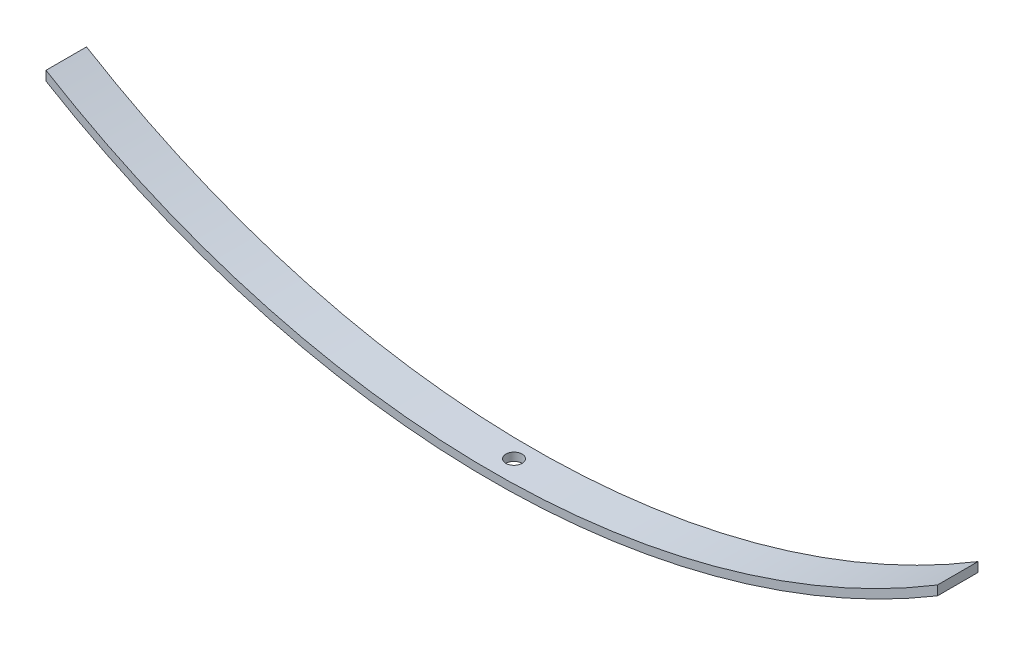
ISO-10303-21;
HEADER;
FILE_DESCRIPTION(('STEP AP214'),'2;1');
FILE_NAME('part.step','',(''),(''),'','','');
FILE_SCHEMA(('AUTOMOTIVE_DESIGN { 1 0 10303 214 1 1 1 1 }'));
ENDSEC;
DATA;
#1=APPLICATION_CONTEXT('core data for automotive mechanical design processes');
#2=APPLICATION_PROTOCOL_DEFINITION('international standard','automotive_design',2000,#1);
#3=PRODUCT_CONTEXT('',#1,'mechanical');
#4=PRODUCT('Part','Part','',(#3));
#5=PRODUCT_RELATED_PRODUCT_CATEGORY('part','',(#4));
#6=PRODUCT_DEFINITION_FORMATION('','',#4);
#7=PRODUCT_DEFINITION_CONTEXT('part definition',#1,'design');
#8=PRODUCT_DEFINITION('design','',#6,#7);
#9=PRODUCT_DEFINITION_SHAPE('','',#8);
#10=(LENGTH_UNIT() NAMED_UNIT(*) SI_UNIT(.MILLI.,.METRE.));
#11=(NAMED_UNIT(*) PLANE_ANGLE_UNIT() SI_UNIT($,.RADIAN.));
#12=(NAMED_UNIT(*) SI_UNIT($,.STERADIAN.) SOLID_ANGLE_UNIT());
#13=UNCERTAINTY_MEASURE_WITH_UNIT(LENGTH_MEASURE(1.E-05),#10,'distance_accuracy_value','');
#14=(GEOMETRIC_REPRESENTATION_CONTEXT(3) GLOBAL_UNCERTAINTY_ASSIGNED_CONTEXT((#13)) GLOBAL_UNIT_ASSIGNED_CONTEXT((#10,
#11,#12)) REPRESENTATION_CONTEXT('',''));
#15=CARTESIAN_POINT('',(0.,0.,0.));
#16=DIRECTION('',(0.,0.,1.));
#17=DIRECTION('',(1.,0.,0.));
#18=AXIS2_PLACEMENT_3D('',#15,#16,#17);
#19=CARTESIAN_POINT('',(-550.,-906.145683651365,50.));
#20=DIRECTION('',(1.,0.,0.));
#21=DIRECTION('',(0.,1.,0.));
#22=AXIS2_PLACEMENT_3D('',#19,#20,#21);
#23=PLANE('',#22);
#24=DIRECTION('',(0.,-1.,0.));
#25=VECTOR('',#24,1.);
#26=CARTESIAN_POINT('',(-550.,-906.145683651365,0.));
#27=LINE('',#26,#25);
#28=CARTESIAN_POINT('',(-550.,-906.145683651365,0.));
#29=VERTEX_POINT('',#28);
#30=CARTESIAN_POINT('',(-550.,-917.823512446701,0.));
#31=VERTEX_POINT('',#30);
#32=EDGE_CURVE('E114',#29,#31,#27,.T.);
#33=ORIENTED_EDGE('',*,*,#32,.T.);
#34=DIRECTION('',(0.,0.,-1.));
#35=VECTOR('',#34,1.);
#36=CARTESIAN_POINT('',(-550.,-917.823512446701,50.));
#37=LINE('',#36,#35);
#38=CARTESIAN_POINT('',(-550.,-917.823512446701,50.));
#39=VERTEX_POINT('',#38);
#40=EDGE_CURVE('E11',#39,#31,#37,.T.);
#41=ORIENTED_EDGE('',*,*,#40,.F.);
#42=DIRECTION('',(0.,-1.,0.));
#43=VECTOR('',#42,1.);
#44=CARTESIAN_POINT('',(-550.,-906.145683651365,50.));
#45=LINE('',#44,#43);
#46=CARTESIAN_POINT('',(-550.,-906.145683651365,50.));
#47=VERTEX_POINT('',#46);
#48=EDGE_CURVE('E95',#47,#39,#45,.T.);
#49=ORIENTED_EDGE('',*,*,#48,.F.);
#50=DIRECTION('',(0.,0.,-1.));
#51=VECTOR('',#50,1.);
#52=CARTESIAN_POINT('',(-550.,-906.145683651365,50.));
#53=LINE('',#52,#51);
#54=EDGE_CURVE('E62',#47,#29,#53,.T.);
#55=ORIENTED_EDGE('',*,*,#54,.T.);
#56=EDGE_LOOP('',(#33,#41,#49,#55));
#57=FACE_BOUND('',#56,.T.);
#58=ADVANCED_FACE('F39',(#57),#23,.F.);
#59=CARTESIAN_POINT('',(0.,0.,50.));
#60=DIRECTION('',(0.,0.,-1.));
#61=DIRECTION('',(-1.,0.,0.));
#62=AXIS2_PLACEMENT_3D('',#59,#60,#61);
#63=CYLINDRICAL_SURFACE('',#62,1070.);
#64=CARTESIAN_POINT('',(0.,-1070.,32.5));
#65=CARTESIAN_POINT('',(0.280946709399363,-1070.00000005261,32.5000020219782));
#66=CARTESIAN_POINT('',(0.561860258569174,-1069.99988911589,32.4881554779434));
#67=CARTESIAN_POINT('',(1.12178434572434,-1069.99944858046,32.4408520448031));
#68=CARTESIAN_POINT('',(1.40079436397135,-1069.99911892426,32.4053889491154));
#69=CARTESIAN_POINT('',(1.9551278123037,-1069.99824971584,32.3110454763084));
#70=CARTESIAN_POINT('',(2.23044699894896,-1069.99770994041,32.2521401958444));
#71=CARTESIAN_POINT('',(2.77514610562203,-1069.99643585478,32.1113315401694));
#72=CARTESIAN_POINT('',(3.04452592036136,-1069.99570154112,32.0294277576122));
#73=CARTESIAN_POINT('',(3.57529048389846,-1069.99405965653,31.843251723385));
#74=CARTESIAN_POINT('',(3.83667913222468,-1069.99315217171,31.7389905873443));
#75=CARTESIAN_POINT('',(4.34974689538885,-1069.99118946,31.5088155518721));
#76=CARTESIAN_POINT('',(4.60142585697582,-1069.99013423078,31.382901310854));
#77=CARTESIAN_POINT('',(5.09321968019006,-1069.98790627522,31.1103501854637));
#78=CARTESIAN_POINT('',(5.3333373685907,-1069.98673357782,30.9637184014588));
#79=CARTESIAN_POINT('',(5.80036342768898,-1069.98430377445,30.6507544032666));
#80=CARTESIAN_POINT('',(6.02727207974481,-1069.98304667028,30.4844226089271));
#81=CARTESIAN_POINT('',(6.46630437336098,-1069.98048352069,30.1332131728421));
#82=CARTESIAN_POINT('',(6.67842590669653,-1069.97917746834,29.9483328957356));
#83=CARTESIAN_POINT('',(7.08634086928212,-1069.97655366153,29.5613602644561));
#84=CARTESIAN_POINT('',(7.28213428171446,-1069.97523590706,29.3592678925554));
#85=CARTESIAN_POINT('',(7.65600828359203,-1069.97262605058,28.93929957536));
#86=CARTESIAN_POINT('',(7.83408818237894,-1069.97133394957,28.7214230152045));
#87=CARTESIAN_POINT('',(8.17126043767984,-1069.96881213292,28.2714421783338));
#88=CARTESIAN_POINT('',(8.33035279781838,-1069.96758241725,28.0393379043347));
#89=CARTESIAN_POINT('',(8.62841890604349,-1069.9652202806,27.5625516582053));
#90=CARTESIAN_POINT('',(8.76739265877536,-1069.9640878596,27.3178696889792));
#91=CARTESIAN_POINT('',(9.02423349328664,-1069.96195246023,26.817667452605));
#92=CARTESIAN_POINT('',(9.14210057433841,-1069.96094948187,26.5621471850833));
#93=CARTESIAN_POINT('',(9.35588973070462,-1069.95910144411,26.042085496426));
#94=CARTESIAN_POINT('',(9.45181185367025,-1069.95825638437,25.7775440948803));
#95=CARTESIAN_POINT('',(9.62102931702547,-1069.95674817298,25.2413203891744));
#96=CARTESIAN_POINT('',(9.6943246581406,-1069.95608502133,24.9696380852433));
#97=CARTESIAN_POINT('',(9.8177656134568,-1069.95495946936,24.4210717927941));
#98=CARTESIAN_POINT('',(9.86791186903572,-1069.95449706348,24.1441879486132));
#99=CARTESIAN_POINT('',(9.94470103652754,-1069.95378610425,23.5871798139389));
#100=CARTESIAN_POINT('',(9.97134394886183,-1069.9535375509,23.3070555235036));
#101=CARTESIAN_POINT('',(10.0009369251396,-1069.95326135348,22.745558693575));
#102=CARTESIAN_POINT('',(10.0038870362827,-1069.95323370897,22.4641861565695));
#103=CARTESIAN_POINT('',(9.98607355343044,-1069.95340011308,21.9021928039145));
#104=CARTESIAN_POINT('',(9.96530995985493,-1069.95359416169,21.6215719882517));
#105=CARTESIAN_POINT('',(9.90021774194708,-1069.95419843338,21.063085892533));
#106=CARTESIAN_POINT('',(9.85588984671182,-1069.95460864978,20.7852205274923));
#107=CARTESIAN_POINT('',(9.74398469566442,-1069.95563360758,20.2342119346919));
#108=CARTESIAN_POINT('',(9.67640744038471,-1069.95624834898,19.9610687068241));
#109=CARTESIAN_POINT('',(9.51848400086335,-1069.95766490618,19.4214458629587));
#110=CARTESIAN_POINT('',(9.42813779081109,-1069.95846672219,19.1549662545155));
#111=CARTESIAN_POINT('',(9.22531886426693,-1069.96023466691,18.6305653092706));
#112=CARTESIAN_POINT('',(9.11284614723762,-1069.96120079564,18.3726439726769));
#113=CARTESIAN_POINT('',(8.86657194696063,-1069.96326995677,17.8671890771995));
#114=CARTESIAN_POINT('',(8.73277013226972,-1069.96437299132,17.6196556798146));
#115=CARTESIAN_POINT('',(8.44479025088656,-1069.96668464098,17.1367404971639));
#116=CARTESIAN_POINT('',(8.29061218406701,-1069.9678932561,16.901358711974));
#117=CARTESIAN_POINT('',(7.96297588230343,-1069.97038175916,16.4444199511567));
#118=CARTESIAN_POINT('',(7.78951765090164,-1069.97166164708,16.2228629729893));
#119=CARTESIAN_POINT('',(7.42455404435858,-1069.97425636637,15.7951486411169));
#120=CARTESIAN_POINT('',(7.2330486687334,-1069.97557119774,15.5889912878247));
#121=CARTESIAN_POINT('',(6.83334437545968,-1069.97819853345,15.1935340163514));
#122=CARTESIAN_POINT('',(6.62514481679003,-1069.97951103771,15.0042347460743));
#123=CARTESIAN_POINT('',(6.19353859250772,-1069.98209641127,14.6438482514079));
#124=CARTESIAN_POINT('',(5.97013192647632,-1069.98336928057,14.4727610275199));
#125=CARTESIAN_POINT('',(5.50969959167318,-1069.98583925222,14.1500149001624));
#126=CARTESIAN_POINT('',(5.27267392085479,-1069.98703635456,13.9983559996124));
#127=CARTESIAN_POINT('',(4.78668858570178,-1069.98932081062,13.7155447885444));
#128=CARTESIAN_POINT('',(4.53772892150938,-1069.99040816433,13.584392477782));
#129=CARTESIAN_POINT('',(4.02964523023157,-1069.99244225764,13.343526841121));
#130=CARTESIAN_POINT('',(3.7705211940157,-1069.99338899709,13.2338135344812));
#131=CARTESIAN_POINT('',(3.24395115983016,-1069.99511498548,13.0366061819905));
#132=CARTESIAN_POINT('',(2.97650516181951,-1069.99589423442,12.949112136249));
#133=CARTESIAN_POINT('',(2.4351927085557,-1069.99726312058,12.7969655059618));
#134=CARTESIAN_POINT('',(2.16132625495607,-1069.99785275785,12.7323129155336));
#135=CARTESIAN_POINT('',(1.60911998119206,-1069.99882568237,12.6263089459468));
#136=CARTESIAN_POINT('',(1.33078016117178,-1069.99920896961,12.5849575660377));
#137=CARTESIAN_POINT('',(0.771616762050556,-1069.99975830284,12.5258512192009));
#138=CARTESIAN_POINT('',(0.490793277391732,-1069.99992435705,12.5080953588967));
#139=CARTESIAN_POINT('',(-0.0713512948975476,-1070.00003453744,12.4963034142504));
#140=CARTESIAN_POINT('',(-0.352672382515532,-1069.99997866362,12.5022673293137));
#141=CARTESIAN_POINT('',(-0.913812039534928,-1069.99964657401,12.5378725206576));
#142=CARTESIAN_POINT('',(-1.19363060903823,-1069.99937035824,12.5675137953324));
#143=CARTESIAN_POINT('',(-1.7497758508029,-1069.99860542548,12.6502629117168));
#144=CARTESIAN_POINT('',(-2.0261025230716,-1069.99811670848,12.7033707533772));
#145=CARTESIAN_POINT('',(-2.57329464434593,-1069.9969406563,12.8326742092626));
#146=CARTESIAN_POINT('',(-2.84416018895979,-1069.9962533246,12.9088694189209));
#147=CARTESIAN_POINT('',(-3.37850947532746,-1069.99469954933,13.0838061441901));
#148=CARTESIAN_POINT('',(-3.64199321719978,-1069.99383310577,13.182547659439));
#149=CARTESIAN_POINT('',(-4.15970589433161,-1069.99194570003,13.4018749406224));
#150=CARTESIAN_POINT('',(-4.4139348292936,-1069.99092473785,13.522460707259));
#151=CARTESIAN_POINT('',(-4.91133073448293,-1069.98875727368,13.7846191786094));
#152=CARTESIAN_POINT('',(-5.15449770436772,-1069.98761077169,13.926191883973));
#153=CARTESIAN_POINT('',(-5.62804832072535,-1069.98522473376,14.2293223353087));
#154=CARTESIAN_POINT('',(-5.85843158332697,-1069.98398519502,14.390880680943));
#155=CARTESIAN_POINT('',(-6.30476924676205,-1069.98144829814,14.7328305346174));
#156=CARTESIAN_POINT('',(-6.52072364733334,-1069.98015093999,14.9132220429996));
#157=CARTESIAN_POINT('',(-6.93666862510528,-1069.97753522893,15.291555984157));
#158=CARTESIAN_POINT('',(-7.13665919289806,-1069.976216876,15.4894984272751));
#159=CARTESIAN_POINT('',(-7.51925473997275,-1069.97359659786,15.9015270782127));
#160=CARTESIAN_POINT('',(-7.70185971896571,-1069.97229467266,16.1156132863003));
#161=CARTESIAN_POINT('',(-8.04839140577304,-1069.96974416613,16.5584145610562));
#162=CARTESIAN_POINT('',(-8.21231753191685,-1069.96849558647,16.7871300829439));
#163=CARTESIAN_POINT('',(-8.52031952595199,-1069.96608725878,17.2575580963166));
#164=CARTESIAN_POINT('',(-8.66439539337814,-1069.96492751075,17.4992705881062));
#165=CARTESIAN_POINT('',(-8.93167235157635,-1069.96272977122,17.9939739235596));
#166=CARTESIAN_POINT('',(-9.05487346610634,-1069.96169177959,18.2469647543868));
#167=CARTESIAN_POINT('',(-9.27952510989939,-1069.95976701951,18.7624264542783));
#168=CARTESIAN_POINT('',(-9.38097563971865,-1069.95888025107,19.0248973231001));
#169=CARTESIAN_POINT('',(-9.56140318093276,-1069.95728312651,19.5574485404603));
#170=CARTESIAN_POINT('',(-9.64038057428726,-1069.9565727674,19.8275287595821));
#171=CARTESIAN_POINT('',(-9.77530252465397,-1069.95534860922,20.3733828059871));
#172=CARTESIAN_POINT('',(-9.83124708181193,-1069.95483481016,20.6491566332341));
#173=CARTESIAN_POINT('',(-9.91970557950575,-1069.95401835847,21.2044376442965));
#174=CARTESIAN_POINT('',(-9.95221948292979,-1069.95371570618,21.4839448340243));
#175=CARTESIAN_POINT('',(-9.99358529494173,-1069.95333014225,22.0447048463585));
#176=CARTESIAN_POINT('',(-10.0024372041507,-1069.9532472306,22.325957668919));
#177=CARTESIAN_POINT('',(-9.9964161971355,-1069.95330350068,22.8881979613776));
#178=CARTESIAN_POINT('',(-9.98154423024218,-1069.95344267352,23.1691854414434));
#179=CARTESIAN_POINT('',(-9.92818301130804,-1069.95393914495,23.728908646602));
#180=CARTESIAN_POINT('',(-9.88969375988386,-1069.95429644353,24.0076443717537));
#181=CARTESIAN_POINT('',(-9.78937157565989,-1069.95521902388,24.5608829882929));
#182=CARTESIAN_POINT('',(-9.72753859610564,-1069.95578430606,24.8353858712016));
#183=CARTESIAN_POINT('',(-9.58096865212942,-1069.95710680606,25.3782067332176));
#184=CARTESIAN_POINT('',(-9.4962316878409,-1069.95786402387,25.6465247123611));
#185=CARTESIAN_POINT('',(-9.30445452363841,-1069.95954891476,26.1750731926403));
#186=CARTESIAN_POINT('',(-9.19741391233159,-1069.96047659099,26.4353035444972));
#187=CARTESIAN_POINT('',(-8.96179146256603,-1069.96247605477,26.9458216873728));
#188=CARTESIAN_POINT('',(-8.83320961998844,-1069.96354784234,27.1961094764904));
#189=CARTESIAN_POINT('',(-8.55542428540885,-1069.96580505963,27.684953771166));
#190=CARTESIAN_POINT('',(-8.4062215909967,-1069.96699048496,27.9235107299749));
#191=CARTESIAN_POINT('',(-8.0882515628819,-1069.96944136421,28.3872078756654));
#192=CARTESIAN_POINT('',(-7.91948424836325,-1069.97070681805,28.6123480757024));
#193=CARTESIAN_POINT('',(-7.56359819644914,-1069.9732817382,29.0475949734432));
#194=CARTESIAN_POINT('',(-7.37648087016256,-1069.97459120113,29.2577028249831));
#195=CARTESIAN_POINT('',(-6.9852095945659,-1069.977217099,29.661415214439));
#196=CARTESIAN_POINT('',(-6.78105528143564,-1069.9785335341,29.855019399745));
#197=CARTESIAN_POINT('',(-6.35711213727609,-1069.98113630944,30.2243889733519));
#198=CARTESIAN_POINT('',(-6.13731947065003,-1069.9824226422,30.4001499594451));
#199=CARTESIAN_POINT('',(-5.68371073552113,-1069.98492833418,30.7325263487437));
#200=CARTESIAN_POINT('',(-5.44989488833631,-1069.98614769447,30.8891420539872));
#201=CARTESIAN_POINT('',(-4.96977576625828,-1069.98848544104,31.1821925004505));
#202=CARTESIAN_POINT('',(-4.7234661635387,-1069.98960377535,31.3186168753402));
#203=CARTESIAN_POINT('',(-4.22022898317542,-1069.99170696479,31.5702153146765));
#204=CARTESIAN_POINT('',(-3.96330159368535,-1069.99269182229,31.6853897554874));
#205=CARTESIAN_POINT('',(-3.4409258912913,-1069.9944991244,31.8935611152162));
#206=CARTESIAN_POINT('',(-3.17548693798505,-1069.99532174075,31.9865815066002));
#207=CARTESIAN_POINT('',(-2.63780704593059,-1069.99678235988,32.1499179917883));
#208=CARTESIAN_POINT('',(-2.36556791372969,-1069.99742041113,32.2202400479897));
#209=CARTESIAN_POINT('',(-1.74755139998692,-1069.99862792379,32.3523719047565));
#210=CARTESIAN_POINT('',(-1.40036592937559,-1069.99914059822,32.4076854069609));
#211=CARTESIAN_POINT('',(-0.702103050329412,-1069.99982660345,32.4814981908989));
#212=CARTESIAN_POINT('',(-0.351025642003471,-1069.99999993426,32.4999974736626));
#213=CARTESIAN_POINT('',(0.,-1070.,32.5));
#214=B_SPLINE_CURVE_WITH_KNOTS('',3,(#64,#65,#66,#67,#68,#69,#70,#71,#72,#73,#74,#75,#76,#77,
#78,#79,#80,#81,#82,#83,#84,#85,#86,#87,#88,#89,#90,#91,#92,#93,#94,#95,#96,#97,#98,#99,#100,
#101,#102,#103,#104,#105,#106,#107,#108,#109,#110,#111,#112,#113,#114,#115,#116,#117,#118,#119,
#120,#121,#122,#123,#124,#125,#126,#127,#128,#129,#130,#131,#132,#133,#134,#135,#136,#137,#138,
#139,#140,#141,#142,#143,#144,#145,#146,#147,#148,#149,#150,#151,#152,#153,#154,#155,#156,#157,
#158,#159,#160,#161,#162,#163,#164,#165,#166,#167,#168,#169,#170,#171,#172,#173,#174,#175,#176,
#177,#178,#179,#180,#181,#182,#183,#184,#185,#186,#187,#188,#189,#190,#191,#192,#193,#194,#195,
#196,#197,#198,#199,#200,#201,#202,#203,#204,#205,#206,#207,#208,#209,#210,#211,#212,#213),
.UNSPECIFIED.,.T.,.F.,(4,2,2,2,2,2,2,2,2,2,2,2,2,2,2,2,2,2,2,2,2,2,2,2,2,2,2,2,2,2,2,2,2,2,2,2,
2,2,2,2,2,2,2,2,2,2,2,2,2,2,2,2,2,2,2,2,2,2,2,2,2,2,2,2,2,2,2,2,2,2,2,2,2,2,4),(0.,
0.842533505309557,1.68528852129294,2.52894122168211,3.37260886567131,4.21585802348987,
5.05912048512914,5.90217570798131,6.74521296681656,7.58837017413102,8.43152824987265,
9.27471918787258,10.1179099649152,10.9611005472681,11.8042911586896,12.6474799391928,
13.4906686926579,14.3338340829951,15.1769994582153,16.0201631537264,16.8633268343126,
17.7064644283038,18.5496020029863,19.3927405334434,20.2358790843792,21.079030738533,
21.9221823979543,22.7653339024686,23.6084854295907,24.4516693474551,25.2948532885383,
26.138037356336,26.9812214140859,27.824406229269,28.6675910486046,29.5107756507889,
30.3539602258154,31.1971128751735,32.0402655033996,32.8834180744486,33.7265706437284,
34.5697084390529,35.4128462208424,36.2559840297381,37.0991218647428,37.9422850039405,
38.7854481584587,39.6286118098692,40.4717754752928,41.3149653901617,42.1581553247906,
43.0013442997636,43.8445332531746,44.6877078746562,45.5308824908024,46.3740584424505,
47.2172343719656,48.0603765619304,48.9035187298813,49.7466625865453,50.5898064382962,
51.432965843291,52.2761254095043,53.1192523724376,53.9623785086529,54.8054398595566,
55.6485192184132,56.4918060757381,57.3350796275585,58.1787846295254,59.0224746869313,
59.8652668284147,60.7078374048043,61.7605312538223,62.8132250733834),.UNSPECIFIED.);
#215=CARTESIAN_POINT('',(0.,-1070.,32.5));
#216=VERTEX_POINT('',#215);
#217=EDGE_CURVE('E117',#216,#216,#214,.T.);
#218=ORIENTED_EDGE('',*,*,#217,.T.);
#219=EDGE_LOOP('',(#218));
#220=FACE_BOUND('',#219,.T.);
#221=CARTESIAN_POINT('',(0.,0.,0.));
#222=DIRECTION('',(0.,0.,1.));
#223=DIRECTION('',(1.,0.,0.));
#224=AXIS2_PLACEMENT_3D('',#221,#222,#223);
#225=CIRCLE('',#224,1070.);
#226=CARTESIAN_POINT('',(550.,-917.823512446701,0.));
#227=VERTEX_POINT('',#226);
#228=EDGE_CURVE('E101',#31,#227,#225,.T.);
#229=ORIENTED_EDGE('',*,*,#228,.T.);
#230=DIRECTION('',(0.,0.,-1.));
#231=VECTOR('',#230,1.);
#232=CARTESIAN_POINT('',(550.,-917.823512446701,50.));
#233=LINE('',#232,#231);
#234=CARTESIAN_POINT('',(550.,-917.823512446701,50.));
#235=VERTEX_POINT('',#234);
#236=EDGE_CURVE('E54',#235,#227,#233,.T.);
#237=ORIENTED_EDGE('',*,*,#236,.F.);
#238=CARTESIAN_POINT('',(0.,0.,50.));
#239=DIRECTION('',(0.,0.,1.));
#240=DIRECTION('',(1.,0.,0.));
#241=AXIS2_PLACEMENT_3D('',#238,#239,#240);
#242=CIRCLE('',#241,1070.);
#243=EDGE_CURVE('E87',#39,#235,#242,.T.);
#244=ORIENTED_EDGE('',*,*,#243,.F.);
#245=ORIENTED_EDGE('',*,*,#40,.T.);
#246=EDGE_LOOP('',(#229,#237,#244,#245));
#247=FACE_BOUND('',#246,.T.);
#248=ADVANCED_FACE('F100',(#220,#247),#63,.T.);
#249=CARTESIAN_POINT('',(550.,-906.145683651365,50.));
#250=DIRECTION('',(1.,0.,0.));
#251=DIRECTION('',(0.,0.,-1.));
#252=AXIS2_PLACEMENT_3D('',#249,#250,#251);
#253=PLANE('',#252);
#254=DIRECTION('',(0.,-1.,0.));
#255=VECTOR('',#254,1.);
#256=CARTESIAN_POINT('',(550.,-906.145683651365,0.));
#257=LINE('',#256,#255);
#258=CARTESIAN_POINT('',(550.,-906.145683651365,0.));
#259=VERTEX_POINT('',#258);
#260=EDGE_CURVE('E120',#259,#227,#257,.T.);
#261=ORIENTED_EDGE('',*,*,#260,.F.);
#262=DIRECTION('',(0.,0.,-1.));
#263=VECTOR('',#262,1.);
#264=CARTESIAN_POINT('',(550.,-906.145683651365,50.));
#265=LINE('',#264,#263);
#266=CARTESIAN_POINT('',(550.,-906.145683651365,50.));
#267=VERTEX_POINT('',#266);
#268=EDGE_CURVE('E76',#267,#259,#265,.T.);
#269=ORIENTED_EDGE('',*,*,#268,.F.);
#270=DIRECTION('',(0.,-1.,0.));
#271=VECTOR('',#270,1.);
#272=CARTESIAN_POINT('',(550.,-906.145683651365,50.));
#273=LINE('',#272,#271);
#274=EDGE_CURVE('E94',#267,#235,#273,.T.);
#275=ORIENTED_EDGE('',*,*,#274,.T.);
#276=ORIENTED_EDGE('',*,*,#236,.T.);
#277=EDGE_LOOP('',(#261,#269,#275,#276));
#278=FACE_BOUND('',#277,.T.);
#279=ADVANCED_FACE('F106',(#278),#253,.T.);
#280=CARTESIAN_POINT('',(0.,0.,50.));
#281=DIRECTION('',(0.,0.,-1.));
#282=DIRECTION('',(-1.,0.,0.));
#283=AXIS2_PLACEMENT_3D('',#280,#281,#282);
#284=CYLINDRICAL_SURFACE('',#283,1060.);
#285=CARTESIAN_POINT('',(0.,-1060.,32.5));
#286=CARTESIAN_POINT('',(0.280946584348206,-1060.00000005311,32.5000020220934));
#287=CARTESIAN_POINT('',(0.56186000698558,-1059.99988806992,32.4881554885509));
#288=CARTESIAN_POINT('',(1.12178384017967,-1059.99944337889,32.4408520981594));
#289=CARTESIAN_POINT('',(1.40079373100566,-1059.99911061302,32.4053890348243));
#290=CARTESIAN_POINT('',(1.95512691926414,-1059.99823320531,32.3110456503398));
#291=CARTESIAN_POINT('',(2.23044597331775,-1059.99768833816,32.2521404262339));
#292=CARTESIAN_POINT('',(2.77514481562961,-1059.996402234,32.1113319083847));
#293=CARTESIAN_POINT('',(3.04452449859756,-1059.99566099352,32.0294282072885));
#294=CARTESIAN_POINT('',(3.5752887959038,-1059.9940036209,31.8432523644932));
#295=CARTESIAN_POINT('',(3.83667730994195,-1059.99308757571,31.7389913389032));
#296=CARTESIAN_POINT('',(4.34974481181648,-1059.99110634953,31.5088165525777));
#297=CARTESIAN_POINT('',(4.60142364640466,-1059.9900411662,31.382902450262));
#298=CARTESIAN_POINT('',(5.09321722992586,-1059.98779219393,31.1103516290593));
#299=CARTESIAN_POINT('',(5.33333480554242,-1059.98660843421,30.9637200103765));
#300=CARTESIAN_POINT('',(5.8003606571583,-1059.9841557098,30.6507563684889));
#301=CARTESIAN_POINT('',(6.02726921450707,-1059.98288674693,30.4844247651191));
#302=CARTESIAN_POINT('',(6.46630145618245,-1059.98029941738,30.1332156423847));
#303=CARTESIAN_POINT('',(6.67842302462288,-1059.97898104367,29.9483354780811));
#304=CARTESIAN_POINT('',(7.08633806907873,-1059.97633248349,29.561363072658));
#305=CARTESIAN_POINT('',(7.28213152827135,-1059.975002297,29.3592708138054));
#306=CARTESIAN_POINT('',(7.65600563784012,-1059.97236781821,28.9393027189671));
#307=CARTESIAN_POINT('',(7.8340855975412,-1059.97106352692,28.7214262681048));
#308=CARTESIAN_POINT('',(8.17125798978058,-1059.96851791795,28.2714456419832));
#309=CARTESIAN_POINT('',(8.33035042594166,-1059.96727660027,28.0393414694386));
#310=CARTESIAN_POINT('',(8.62841675297272,-1059.96489217678,27.5625553311994));
#311=CARTESIAN_POINT('',(8.76739064149245,-1059.963749071,27.3178733640354));
#312=CARTESIAN_POINT('',(9.02423174592911,-1059.96159352313,26.8176711092513));
#313=CARTESIAN_POINT('',(9.14209896111197,-1059.96058108105,26.5621508212542));
#314=CARTESIAN_POINT('',(9.35588838032539,-1059.95871560566,26.0420890694925));
#315=CARTESIAN_POINT('',(9.45181063206887,-1059.957862572,25.7775476253433));
#316=CARTESIAN_POINT('',(9.62102834409218,-1059.95634012899,25.2413238128445));
#317=CARTESIAN_POINT('',(9.69432380511083,-1059.95567071964,24.969641444728));
#318=CARTESIAN_POINT('',(9.81776495300685,-1059.95453454668,24.4210751591308));
#319=CARTESIAN_POINT('',(9.86791129425824,-1059.95406777733,24.1441913889122));
#320=CARTESIAN_POINT('',(9.94470064402974,-1059.95335010869,23.5871833899874));
#321=CARTESIAN_POINT('',(9.9713436529791,-1059.95309920939,23.3070591613404));
#322=CARTESIAN_POINT('',(10.0009368315469,-1059.9528204042,22.7455624456118));
#323=CARTESIAN_POINT('',(10.0038870484492,-1059.95279249787,22.4641899610224));
#324=CARTESIAN_POINT('',(9.98607378550728,-1059.9529604699,21.9021967050847));
#325=CARTESIAN_POINT('',(9.96531030609027,-1059.95315634825,21.6215759337227));
#326=CARTESIAN_POINT('',(9.90021834436419,-1059.95376631874,21.0630900864696));
#327=CARTESIAN_POINT('',(9.85589060514177,-1059.95418040401,20.7852249239632));
#328=CARTESIAN_POINT('',(9.74398580294951,-1059.95521502892,20.2342167248068));
#329=CARTESIAN_POINT('',(9.67640874052277,-1059.95583556856,19.9610736880465));
#330=CARTESIAN_POINT('',(9.51848572371814,-1059.95726548699,19.4214512112829));
#331=CARTESIAN_POINT('',(9.42813974349648,-1059.958074866,19.1549717788434));
#332=CARTESIAN_POINT('',(9.22532131348973,-1059.95985948679,18.6305711663604));
#333=CARTESIAN_POINT('',(9.11284886315724,-1059.96083472857,18.3726499865285));
#334=CARTESIAN_POINT('',(8.8665751949722,-1059.96292340768,17.8671953037659));
#335=CARTESIAN_POINT('',(8.73277363926302,-1059.96403684719,17.6196619654586));
#336=CARTESIAN_POINT('',(8.44479429713416,-1059.96637030295,17.1367468776052));
#337=CARTESIAN_POINT('',(8.29061651058448,-1059.9675903192,16.9013651281366));
#338=CARTESIAN_POINT('',(7.96298078682747,-1059.97010229707,16.4444264090993));
#339=CARTESIAN_POINT('',(7.78952285308146,-1059.97139425868,16.2228694370487));
#340=CARTESIAN_POINT('',(7.4245598551457,-1059.97401345524,15.7951550835713));
#341=CARTESIAN_POINT('',(7.23305479046283,-1059.97534069018,15.5889977025654));
#342=CARTESIAN_POINT('',(6.83335098118503,-1059.97799281239,15.1935401938286));
#343=CARTESIAN_POINT('',(6.62515158345991,-1059.97931769955,15.0042407262397));
#344=CARTESIAN_POINT('',(6.19354566028855,-1059.98192746531,14.6438538228687));
#345=CARTESIAN_POINT('',(5.97013913441568,-1059.98321234391,14.4727663875976));
#346=CARTESIAN_POINT('',(5.50970705525377,-1059.98570561966,14.1500198242902));
#347=CARTESIAN_POINT('',(5.27268149991302,-1059.98691401681,13.998360699181));
#348=CARTESIAN_POINT('',(4.7866963677902,-1059.98922002738,13.7155490281529));
#349=CARTESIAN_POINT('',(4.53773679115306,-1059.9903176408,13.584396481985));
#350=CARTESIAN_POINT('',(4.02965324006816,-1059.99237092721,13.3435303648615));
#351=CARTESIAN_POINT('',(3.77052925630749,-1059.99332660007,13.2338168135494));
#352=CARTESIAN_POINT('',(3.24395929545183,-1059.99506887533,13.0366089692603));
#353=CARTESIAN_POINT('',(2.97651331831506,-1059.99585547773,12.9491146763949));
#354=CARTESIAN_POINT('',(2.43520087718173,-1059.99723728213,12.7969675543235));
#355=CARTESIAN_POINT('',(2.16133441486457,-1059.99783248418,12.7323147191431));
#356=CARTESIAN_POINT('',(1.6091280955505,-1059.99881459158,12.6263102664249));
#357=CARTESIAN_POINT('',(1.33078823870042,-1059.99920149693,12.5849586481223));
#358=CARTESIAN_POINT('',(0.77162494237483,-1059.99975601669,12.5258518556675));
#359=CARTESIAN_POINT('',(0.490801599132531,-1059.99992363955,12.5080957712042));
#360=CARTESIAN_POINT('',(-0.071342710693692,-1060.00003486381,12.4963033565812));
#361=CARTESIAN_POINT('',(-0.352663677264907,-1059.9999784652,12.5022670258157));
#362=CARTESIAN_POINT('',(-0.91380311134412,-1059.99964324747,12.5378717052939));
#363=CARTESIAN_POINT('',(-1.19362157895722,-1059.99936442837,12.5675127138814));
#364=CARTESIAN_POINT('',(-1.74976663636781,-1059.99859228428,12.6502612785661));
#365=CARTESIAN_POINT('',(-2.02609322617277,-1059.9980989593,12.7033688346131));
#366=CARTESIAN_POINT('',(-2.57328511112292,-1059.99691181759,12.8326716784161));
#367=CARTESIAN_POINT('',(-2.84415050369338,-1059.99621800443,12.9088665539154));
#368=CARTESIAN_POINT('',(-3.3784995128294,-1059.99464957655,13.0838025768682));
#369=CARTESIAN_POINT('',(-3.64198312951571,-1059.99377496182,13.1825437239529));
#370=CARTESIAN_POINT('',(-4.15969558860484,-1059.99186975591,13.4018702365201));
#371=CARTESIAN_POINT('',(-4.41392443068157,-1059.99083916473,13.5224556027723));
#372=CARTESIAN_POINT('',(-4.91132018727455,-1059.98865125796,13.7846132433663));
#373=CARTESIAN_POINT('',(-5.15448710144171,-1059.98749394237,13.9261855183705));
#374=CARTESIAN_POINT('',(-5.62803778503295,-1059.98508539847,14.2293151696099));
#375=CARTESIAN_POINT('',(-5.85842116327858,-1059.98383416729,14.3908731569236));
#376=CARTESIAN_POINT('',(-6.30475909014677,-1059.98127333946,14.7328222943886));
#377=CARTESIAN_POINT('',(-6.52071363850222,-1059.97996374281,14.9132134448885));
#378=CARTESIAN_POINT('',(-6.93665894786419,-1059.97732335599,15.2915466762952));
#379=CARTESIAN_POINT('',(-7.13664969940709,-1059.97599256581,15.4894887676064));
#380=CARTESIAN_POINT('',(-7.5192456514605,-1059.97334756745,15.9015167263907));
#381=CARTESIAN_POINT('',(-7.70185085167683,-1059.97203335926,16.1156025941369));
#382=CARTESIAN_POINT('',(-8.04838312062709,-1059.96945878853,16.5584033356973));
#383=CARTESIAN_POINT('',(-8.21230959677797,-1059.96819842769,16.7871186732725));
#384=CARTESIAN_POINT('',(-8.52031230477512,-1059.96576737509,17.2575463569666));
#385=CARTESIAN_POINT('',(-8.66438853614721,-1059.96459668332,17.4992587033961));
#386=CARTESIAN_POINT('',(-8.93166623202528,-1059.96237820449,17.993961789564));
#387=CARTESIAN_POINT('',(-9.05486772032143,-1059.96133041729,18.2469525164484));
#388=CARTESIAN_POINT('',(-9.27952011671571,-1059.95938749238,18.7624140517701));
#389=CARTESIAN_POINT('',(-9.38097102538005,-1059.95849235466,19.0248848599605));
#390=CARTESIAN_POINT('',(-9.56139929543442,-1059.95688015591,19.5574359154949));
#391=CARTESIAN_POINT('',(-9.6403770458609,-1059.95616309178,19.8275160310241));
#392=CARTESIAN_POINT('',(-9.77529971900456,-1059.95492737776,20.3733699088328));
#393=CARTESIAN_POINT('',(-9.83124464187078,-1059.95440872787,20.6491436710755));
#394=CARTESIAN_POINT('',(-9.91970387457964,-1059.95358456646,21.2044245879638));
#395=CARTESIAN_POINT('',(-9.95221814740845,-1059.95327905529,21.4839317485063));
#396=CARTESIAN_POINT('',(-9.99358469808434,-1059.95288984673,22.0446917365487));
#397=CARTESIAN_POINT('',(-10.0024369765644,-1059.95280614934,22.3259445640019));
#398=CARTESIAN_POINT('',(-9.99641670711445,-1059.95286294336,22.8881846935362));
#399=CARTESIAN_POINT('',(-9.98154512565411,-1059.95300342563,23.1691720059672));
#400=CARTESIAN_POINT('',(-9.92818470658138,-1059.95350457372,23.7288949073403));
#401=CARTESIAN_POINT('',(-9.88969586959782,-1059.95386523952,24.0076304963423));
#402=CARTESIAN_POINT('',(-9.78937454164448,-1059.95479651649,24.5608688730521));
#403=CARTESIAN_POINT('',(-9.72754200392926,-1059.95536712809,24.8353716522825));
#404=CARTESIAN_POINT('',(-9.58097296960598,-1059.95670209778,25.3781923414521));
#405=CARTESIAN_POINT('',(-9.4962364731259,-1059.95746645588,25.6465102514259));
#406=CARTESIAN_POINT('',(-9.30446026916011,-1059.95916723565,26.1750586300429));
#407=CARTESIAN_POINT('',(-9.19742015033898,-1059.9601036605,26.4352889494288));
#408=CARTESIAN_POINT('',(-8.96179870770165,-1059.96212198139,26.945807068741));
#409=CARTESIAN_POINT('',(-8.83321737976848,-1059.96320387745,27.1960948667672));
#410=CARTESIAN_POINT('',(-8.55543309241778,-1059.96548238426,27.6849392266996));
#411=CARTESIAN_POINT('',(-8.40623093049,-1059.96667899057,27.9234962417984));
#412=CARTESIAN_POINT('',(-8.0882619807592,-1059.96915298728,28.3871935515233));
#413=CARTESIAN_POINT('',(-7.919495212128,-1059.97043037761,28.6123338592964));
#414=CARTESIAN_POINT('',(-7.56361013005285,-1059.97302958753,29.047581186366));
#415=CARTESIAN_POINT('',(-7.37649321444006,-1059.97435140374,29.2576893486376));
#416=CARTESIAN_POINT('',(-6.98522273545511,-1059.97700207468,29.661402395243));
#417=CARTESIAN_POINT('',(-6.78106880825639,-1059.97833092956,29.855006926962));
#418=CARTESIAN_POINT('',(-6.35712640594123,-1059.98095826128,30.2243772288435));
#419=CARTESIAN_POINT('',(-6.13733409524922,-1059.98225673057,30.4001385968402));
#420=CARTESIAN_POINT('',(-5.68372603551286,-1059.98478606453,30.7325157844114));
#421=CARTESIAN_POINT('',(-5.44991050778364,-1059.98601693026,30.8891319060188));
#422=CARTESIAN_POINT('',(-4.96979190737855,-1059.98837673623,31.1821832629788));
#423=CARTESIAN_POINT('',(-4.72348250297735,-1059.98950562395,31.3186081256654));
#424=CARTESIAN_POINT('',(-4.22024566651422,-1059.99162866155,31.5702075542553));
#425=CARTESIAN_POINT('',(-3.96331842261025,-1059.99262281379,31.6853824965295));
#426=CARTESIAN_POINT('',(-3.44094295376618,-1059.99444717367,31.8935548674749));
#427=CARTESIAN_POINT('',(-3.17550408838321,-1059.99527755464,31.9865757683566));
#428=CARTESIAN_POINT('',(-2.63782431812397,-1059.9967519617,32.1499132730886));
#429=CARTESIAN_POINT('',(-2.3655852197896,-1059.99739603671,32.2202358392719));
#430=CARTESIAN_POINT('',(-1.74756596681654,-1059.99861495653,32.3523694255879));
#431=CARTESIAN_POINT('',(-1.4003776449176,-1059.99913247613,32.4076838557039));
#432=CARTESIAN_POINT('',(-0.702108958754502,-1059.99982496467,32.4814978791332));
#433=CARTESIAN_POINT('',(-0.351028594601317,-1059.99999993364,32.4999974734963));
#434=CARTESIAN_POINT('',(0.,-1060.,32.5));
#435=B_SPLINE_CURVE_WITH_KNOTS('',3,(#285,#286,#287,#288,#289,#290,#291,#292,#293,#294,#295,
#296,#297,#298,#299,#300,#301,#302,#303,#304,#305,#306,#307,#308,#309,#310,#311,#312,#313,#314,
#315,#316,#317,#318,#319,#320,#321,#322,#323,#324,#325,#326,#327,#328,#329,#330,#331,#332,#333,
#334,#335,#336,#337,#338,#339,#340,#341,#342,#343,#344,#345,#346,#347,#348,#349,#350,#351,#352,
#353,#354,#355,#356,#357,#358,#359,#360,#361,#362,#363,#364,#365,#366,#367,#368,#369,#370,#371,
#372,#373,#374,#375,#376,#377,#378,#379,#380,#381,#382,#383,#384,#385,#386,#387,#388,#389,#390,
#391,#392,#393,#394,#395,#396,#397,#398,#399,#400,#401,#402,#403,#404,#405,#406,#407,#408,#409,
#410,#411,#412,#413,#414,#415,#416,#417,#418,#419,#420,#421,#422,#423,#424,#425,#426,#427,#428,
#429,#430,#431,#432,#433,#434),.UNSPECIFIED.,.T.,.F.,(4,2,2,2,2,2,2,2,2,2,2,2,2,2,2,2,2,2,2,2,2,
2,2,2,2,2,2,2,2,2,2,2,2,2,2,2,2,2,2,2,2,2,2,2,2,2,2,2,2,2,2,2,2,2,2,2,2,2,2,2,2,2,2,2,2,2,2,2,2,
2,2,2,2,2,4),(0.,0.842533127522199,1.68528776238952,2.52894006813992,3.37260731774666,
4.21585606281373,5.05911811146233,5.90217292778718,6.74520978063723,7.58836701797004,
8.43152512399476,9.27471609310212,10.1179069013305,10.9610978080598,11.8042887441143,
12.6474778468784,13.4906669221103,14.3338321608067,15.1769973841043,16.0201609246924,
16.863324450092,17.7064613883464,18.5495983069049,19.3927361824673,20.2358740788884,
21.0790253320831,21.9221765906567,22.765327697861,23.6084788281037,24.4516629609466,
25.2948471174444,26.1380314009692,26.9812156742553,27.8244007201085,28.6675857701942,
29.5107705997325,30.3539554015985,31.1971076726211,32.0402599221108,32.8834121126188,
33.7265643013228,34.5697014352434,35.412838555373,36.2559757052113,37.0991128816574,
37.9422758440387,38.7854388220288,39.628602299857,40.4717657919524,41.3149560259903,
42.1581462801711,43.0013355733934,43.8445248446662,44.6876995184663,45.5308741868106,
46.3740501871311,47.2172261648944,48.0603677939774,48.9035094006108,49.7466526956323,
50.5897959859422,51.4329548273309,52.2761138298647,53.1192402332035,53.9623658103501,
54.8054272118197,55.648506621533,56.4917935281745,57.3350671295189,58.1787724453379,
59.0224628163214,59.8652552805174,60.7078261819167,61.7605288826044,62.8132315532751),.UNSPECIFIED.);
#436=CARTESIAN_POINT('',(0.,-1060.,32.5));
#437=VERTEX_POINT('',#436);
#438=EDGE_CURVE('E42',#437,#437,#435,.T.);
#439=ORIENTED_EDGE('',*,*,#438,.F.);
#440=EDGE_LOOP('',(#439));
#441=FACE_BOUND('',#440,.T.);
#442=CARTESIAN_POINT('',(0.,0.,0.));
#443=DIRECTION('',(0.,0.,1.));
#444=DIRECTION('',(1.,0.,0.));
#445=AXIS2_PLACEMENT_3D('',#442,#443,#444);
#446=CIRCLE('',#445,1060.);
#447=EDGE_CURVE('E123',#29,#259,#446,.T.);
#448=ORIENTED_EDGE('',*,*,#447,.F.);
#449=ORIENTED_EDGE('',*,*,#54,.F.);
#450=CARTESIAN_POINT('',(0.,0.,50.));
#451=DIRECTION('',(0.,0.,1.));
#452=DIRECTION('',(1.,0.,0.));
#453=AXIS2_PLACEMENT_3D('',#450,#451,#452);
#454=CIRCLE('',#453,1060.);
#455=EDGE_CURVE('E108',#47,#267,#454,.T.);
#456=ORIENTED_EDGE('',*,*,#455,.T.);
#457=ORIENTED_EDGE('',*,*,#268,.T.);
#458=EDGE_LOOP('',(#448,#449,#456,#457));
#459=FACE_BOUND('',#458,.T.);
#460=ADVANCED_FACE('F149',(#441,#459),#284,.F.);
#461=CARTESIAN_POINT('',(0.,0.,50.));
#462=DIRECTION('',(0.,0.,1.));
#463=DIRECTION('',(1.,0.,0.));
#464=AXIS2_PLACEMENT_3D('',#461,#462,#463);
#465=PLANE('',#464);
#466=ORIENTED_EDGE('',*,*,#48,.T.);
#467=ORIENTED_EDGE('',*,*,#243,.T.);
#468=ORIENTED_EDGE('',*,*,#274,.F.);
#469=ORIENTED_EDGE('',*,*,#455,.F.);
#470=EDGE_LOOP('',(#466,#467,#468,#469));
#471=FACE_BOUND('',#470,.T.);
#472=ADVANCED_FACE('F91',(#471),#465,.T.);
#473=CARTESIAN_POINT('',(0.,0.,0.));
#474=DIRECTION('',(0.,0.,1.));
#475=DIRECTION('',(1.,0.,0.));
#476=AXIS2_PLACEMENT_3D('',#473,#474,#475);
#477=PLANE('',#476);
#478=ORIENTED_EDGE('',*,*,#32,.F.);
#479=ORIENTED_EDGE('',*,*,#447,.T.);
#480=ORIENTED_EDGE('',*,*,#260,.T.);
#481=ORIENTED_EDGE('',*,*,#228,.F.);
#482=EDGE_LOOP('',(#478,#479,#480,#481));
#483=FACE_BOUND('',#482,.T.);
#484=ADVANCED_FACE('F144',(#483),#477,.F.);
#485=CARTESIAN_POINT('',(0.,-1070.,22.5));
#486=DIRECTION('',(0.,1.,0.));
#487=DIRECTION('',(0.,0.,1.));
#488=AXIS2_PLACEMENT_3D('',#485,#486,#487);
#489=CYLINDRICAL_SURFACE('',#488,10.);
#490=ORIENTED_EDGE('',*,*,#438,.T.);
#491=EDGE_LOOP('',(#490));
#492=FACE_BOUND('',#491,.T.);
#493=ORIENTED_EDGE('',*,*,#217,.F.);
#494=EDGE_LOOP('',(#493));
#495=FACE_BOUND('',#494,.T.);
#496=ADVANCED_FACE('F140',(#492,#495),#489,.F.);
#497=CLOSED_SHELL('',(#58,#248,#279,#460,#472,#484,#496));
#498=MANIFOLD_SOLID_BREP('B2',#497);
#499=ADVANCED_BREP_SHAPE_REPRESENTATION('',(#18,#498),#14);
#500=SHAPE_DEFINITION_REPRESENTATION(#9,#499);
ENDSEC;
END-ISO-10303-21;
